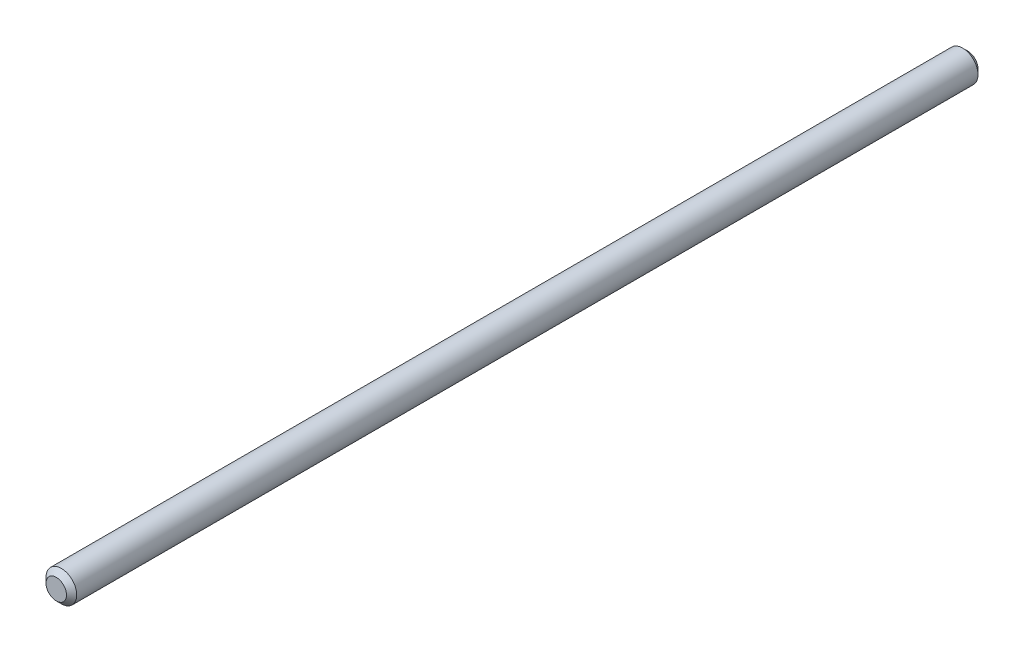
ISO-10303-21;
HEADER;
FILE_DESCRIPTION(('STEP AP214'),'2;1');
FILE_NAME('part.step','',(''),(''),'','','');
FILE_SCHEMA(('AUTOMOTIVE_DESIGN { 1 0 10303 214 1 1 1 1 }'));
ENDSEC;
DATA;
#1=APPLICATION_CONTEXT('core data for automotive mechanical design processes');
#2=APPLICATION_PROTOCOL_DEFINITION('international standard','automotive_design',2000,#1);
#3=PRODUCT_CONTEXT('',#1,'mechanical');
#4=PRODUCT('Part','Part','',(#3));
#5=PRODUCT_RELATED_PRODUCT_CATEGORY('part','',(#4));
#6=PRODUCT_DEFINITION_FORMATION('','',#4);
#7=PRODUCT_DEFINITION_CONTEXT('part definition',#1,'design');
#8=PRODUCT_DEFINITION('design','',#6,#7);
#9=PRODUCT_DEFINITION_SHAPE('','',#8);
#10=(LENGTH_UNIT() NAMED_UNIT(*) SI_UNIT(.MILLI.,.METRE.));
#11=(NAMED_UNIT(*) PLANE_ANGLE_UNIT() SI_UNIT($,.RADIAN.));
#12=(NAMED_UNIT(*) SI_UNIT($,.STERADIAN.) SOLID_ANGLE_UNIT());
#13=UNCERTAINTY_MEASURE_WITH_UNIT(LENGTH_MEASURE(1.E-05),#10,'distance_accuracy_value','');
#14=(GEOMETRIC_REPRESENTATION_CONTEXT(3) GLOBAL_UNCERTAINTY_ASSIGNED_CONTEXT((#13)) GLOBAL_UNIT_ASSIGNED_CONTEXT((#10,
#11,#12)) REPRESENTATION_CONTEXT('',''));
#15=CARTESIAN_POINT('',(0.,0.,0.));
#16=DIRECTION('',(0.,0.,1.));
#17=DIRECTION('',(1.,0.,0.));
#18=AXIS2_PLACEMENT_3D('',#15,#16,#17);
#19=CARTESIAN_POINT('',(0.,0.,89.));
#20=DIRECTION('',(0.,0.,-1.));
#21=DIRECTION('',(-1.,0.,0.));
#22=AXIS2_PLACEMENT_3D('',#19,#20,#21);
#23=CYLINDRICAL_SURFACE('',#22,3.);
#24=CARTESIAN_POINT('',(0.,0.,-88.0000000000001));
#25=DIRECTION('',(0.,0.,1.));
#26=DIRECTION('',(1.,0.,0.));
#27=AXIS2_PLACEMENT_3D('',#24,#25,#26);
#28=CIRCLE('',#27,3.);
#29=CARTESIAN_POINT('',(3.,0.,-88.0000000000001));
#30=VERTEX_POINT('',#29);
#31=EDGE_CURVE('E41',#30,#30,#28,.T.);
#32=ORIENTED_EDGE('',*,*,#31,.T.);
#33=EDGE_LOOP('',(#32));
#34=FACE_BOUND('',#33,.T.);
#35=CARTESIAN_POINT('',(0.,0.,88.));
#36=DIRECTION('',(0.,0.,1.));
#37=DIRECTION('',(1.,0.,0.));
#38=AXIS2_PLACEMENT_3D('',#35,#36,#37);
#39=CIRCLE('',#38,3.);
#40=CARTESIAN_POINT('',(3.,0.,88.));
#41=VERTEX_POINT('',#40);
#42=EDGE_CURVE('E45',#41,#41,#39,.F.);
#43=ORIENTED_EDGE('',*,*,#42,.T.);
#44=EDGE_LOOP('',(#43));
#45=FACE_BOUND('',#44,.T.);
#46=ADVANCED_FACE('F30',(#34,#45),#23,.T.);
#47=CARTESIAN_POINT('',(0.,0.,89.));
#48=DIRECTION('',(0.,0.,1.));
#49=DIRECTION('',(1.,0.,0.));
#50=AXIS2_PLACEMENT_3D('',#47,#48,#49);
#51=PLANE('',#50);
#52=CARTESIAN_POINT('',(0.,0.,89.));
#53=DIRECTION('',(0.,0.,1.));
#54=DIRECTION('',(1.,0.,0.));
#55=AXIS2_PLACEMENT_3D('',#52,#53,#54);
#56=CIRCLE('',#55,2.00000000000003);
#57=CARTESIAN_POINT('',(2.00000000000003,0.,89.));
#58=VERTEX_POINT('',#57);
#59=EDGE_CURVE('E10',#58,#58,#56,.T.);
#60=ORIENTED_EDGE('',*,*,#59,.T.);
#61=EDGE_LOOP('',(#60));
#62=FACE_BOUND('',#61,.T.);
#63=ADVANCED_FACE('F61',(#62),#51,.T.);
#64=CARTESIAN_POINT('',(0.,0.,-89.));
#65=DIRECTION('',(0.,0.,1.));
#66=DIRECTION('',(1.,0.,0.));
#67=AXIS2_PLACEMENT_3D('',#64,#65,#66);
#68=PLANE('',#67);
#69=CARTESIAN_POINT('',(0.,0.,-89.));
#70=DIRECTION('',(0.,0.,1.));
#71=DIRECTION('',(1.,0.,0.));
#72=AXIS2_PLACEMENT_3D('',#69,#70,#71);
#73=CIRCLE('',#72,2.00000000000004);
#74=CARTESIAN_POINT('',(2.00000000000004,0.,-89.));
#75=VERTEX_POINT('',#74);
#76=EDGE_CURVE('E37',#75,#75,#73,.F.);
#77=ORIENTED_EDGE('',*,*,#76,.T.);
#78=EDGE_LOOP('',(#77));
#79=FACE_BOUND('',#78,.T.);
#80=ADVANCED_FACE('F58',(#79),#68,.F.);
#81=CARTESIAN_POINT('',(0.,0.,-88.0000000000001));
#82=DIRECTION('',(0.,0.,1.));
#83=DIRECTION('',(1.,0.,0.));
#84=AXIS2_PLACEMENT_3D('',#81,#82,#83);
#85=CONICAL_SURFACE('',#84,3.,0.785398163397454);
#86=ORIENTED_EDGE('',*,*,#76,.F.);
#87=EDGE_LOOP('',(#86));
#88=FACE_BOUND('',#87,.T.);
#89=ORIENTED_EDGE('',*,*,#31,.F.);
#90=EDGE_LOOP('',(#89));
#91=FACE_BOUND('',#90,.T.);
#92=ADVANCED_FACE('F54',(#88,#91),#85,.T.);
#93=CARTESIAN_POINT('',(0.,0.,89.));
#94=DIRECTION('',(0.,0.,-1.));
#95=DIRECTION('',(-1.,0.,0.));
#96=AXIS2_PLACEMENT_3D('',#93,#94,#95);
#97=CONICAL_SURFACE('',#96,2.00000000000003,0.78539816339744);
#98=ORIENTED_EDGE('',*,*,#42,.F.);
#99=EDGE_LOOP('',(#98));
#100=FACE_BOUND('',#99,.T.);
#101=ORIENTED_EDGE('',*,*,#59,.F.);
#102=EDGE_LOOP('',(#101));
#103=FACE_BOUND('',#102,.T.);
#104=ADVANCED_FACE('F32',(#100,#103),#97,.T.);
#105=CLOSED_SHELL('',(#46,#63,#80,#92,#104));
#106=MANIFOLD_SOLID_BREP('B2',#105);
#107=ADVANCED_BREP_SHAPE_REPRESENTATION('',(#18,#106),#14);
#108=SHAPE_DEFINITION_REPRESENTATION(#9,#107);
ENDSEC;
END-ISO-10303-21;
